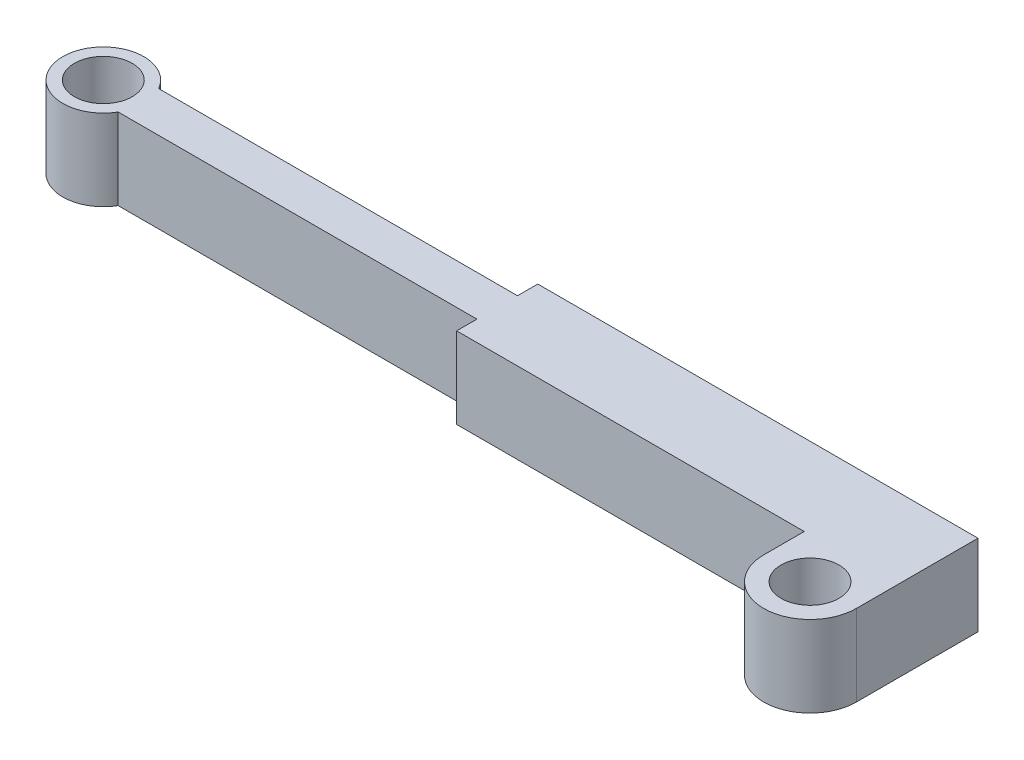
ISO-10303-21;
HEADER;
FILE_DESCRIPTION(('STEP AP214'),'2;1');
FILE_NAME('part.step','',(''),(''),'','','');
FILE_SCHEMA(('AUTOMOTIVE_DESIGN { 1 0 10303 214 1 1 1 1 }'));
ENDSEC;
DATA;
#1=APPLICATION_CONTEXT('core data for automotive mechanical design processes');
#2=APPLICATION_PROTOCOL_DEFINITION('international standard','automotive_design',2000,#1);
#3=PRODUCT_CONTEXT('',#1,'mechanical');
#4=PRODUCT('Part','Part','',(#3));
#5=PRODUCT_RELATED_PRODUCT_CATEGORY('part','',(#4));
#6=PRODUCT_DEFINITION_FORMATION('','',#4);
#7=PRODUCT_DEFINITION_CONTEXT('part definition',#1,'design');
#8=PRODUCT_DEFINITION('design','',#6,#7);
#9=PRODUCT_DEFINITION_SHAPE('','',#8);
#10=(LENGTH_UNIT() NAMED_UNIT(*) SI_UNIT(.MILLI.,.METRE.));
#11=(NAMED_UNIT(*) PLANE_ANGLE_UNIT() SI_UNIT($,.RADIAN.));
#12=(NAMED_UNIT(*) SI_UNIT($,.STERADIAN.) SOLID_ANGLE_UNIT());
#13=UNCERTAINTY_MEASURE_WITH_UNIT(LENGTH_MEASURE(1.E-05),#10,'distance_accuracy_value','');
#14=(GEOMETRIC_REPRESENTATION_CONTEXT(3) GLOBAL_UNCERTAINTY_ASSIGNED_CONTEXT((#13)) GLOBAL_UNIT_ASSIGNED_CONTEXT((#10,
#11,#12)) REPRESENTATION_CONTEXT('',''));
#15=CARTESIAN_POINT('',(0.,0.,0.));
#16=DIRECTION('',(0.,0.,1.));
#17=DIRECTION('',(1.,0.,0.));
#18=AXIS2_PLACEMENT_3D('',#15,#16,#17);
#19=CARTESIAN_POINT('',(0.,7.,-3.5));
#20=DIRECTION('',(0.,0.,-1.));
#21=DIRECTION('',(-1.,0.,0.));
#22=AXIS2_PLACEMENT_3D('',#19,#20,#21);
#23=PLANE('',#22);
#24=DIRECTION('',(1.,0.,0.));
#25=VECTOR('',#24,1.);
#26=CARTESIAN_POINT('',(0.,0.,-3.5));
#27=LINE('',#26,#25);
#28=CARTESIAN_POINT('',(38.,0.,-3.5));
#29=VERTEX_POINT('',#28);
#30=CARTESIAN_POINT('',(76.,0.,-3.5));
#31=VERTEX_POINT('',#30);
#32=EDGE_CURVE('E144',#29,#31,#27,.T.);
#33=ORIENTED_EDGE('',*,*,#32,.F.);
#34=DIRECTION('',(0.,-1.,0.));
#35=VECTOR('',#34,1.);
#36=CARTESIAN_POINT('',(38.,7.,-3.5));
#37=LINE('',#36,#35);
#38=CARTESIAN_POINT('',(38.,7.,-3.5));
#39=VERTEX_POINT('',#38);
#40=EDGE_CURVE('E11',#39,#29,#37,.T.);
#41=ORIENTED_EDGE('',*,*,#40,.F.);
#42=DIRECTION('',(1.,0.,0.));
#43=VECTOR('',#42,1.);
#44=CARTESIAN_POINT('',(0.,7.,-3.5));
#45=LINE('',#44,#43);
#46=CARTESIAN_POINT('',(76.,7.,-3.5));
#47=VERTEX_POINT('',#46);
#48=EDGE_CURVE('E173',#39,#47,#45,.T.);
#49=ORIENTED_EDGE('',*,*,#48,.T.);
#50=DIRECTION('',(0.,-1.,0.));
#51=VECTOR('',#50,1.);
#52=CARTESIAN_POINT('',(76.,7.,-3.5));
#53=LINE('',#52,#51);
#54=EDGE_CURVE('E90',#47,#31,#53,.T.);
#55=ORIENTED_EDGE('',*,*,#54,.T.);
#56=EDGE_LOOP('',(#33,#41,#49,#55));
#57=FACE_BOUND('',#56,.T.);
#58=ADVANCED_FACE('F33',(#57),#23,.T.);
#59=CARTESIAN_POINT('',(38.,7.,0.));
#60=DIRECTION('',(-1.,0.,0.));
#61=DIRECTION('',(0.,0.,1.));
#62=AXIS2_PLACEMENT_3D('',#59,#60,#61);
#63=PLANE('',#62);
#64=DIRECTION('',(0.,0.,-1.));
#65=VECTOR('',#64,1.);
#66=CARTESIAN_POINT('',(38.,0.,0.));
#67=LINE('',#66,#65);
#68=CARTESIAN_POINT('',(38.,0.,-1.75));
#69=VERTEX_POINT('',#68);
#70=EDGE_CURVE('E147',#69,#29,#67,.T.);
#71=ORIENTED_EDGE('',*,*,#70,.F.);
#72=DIRECTION('',(0.,-1.,0.));
#73=VECTOR('',#72,1.);
#74=CARTESIAN_POINT('',(38.,7.,-1.75));
#75=LINE('',#74,#73);
#76=CARTESIAN_POINT('',(38.,7.,-1.75));
#77=VERTEX_POINT('',#76);
#78=EDGE_CURVE('E41',#77,#69,#75,.T.);
#79=ORIENTED_EDGE('',*,*,#78,.F.);
#80=DIRECTION('',(0.,0.,-1.));
#81=VECTOR('',#80,1.);
#82=CARTESIAN_POINT('',(38.,7.,0.));
#83=LINE('',#82,#81);
#84=EDGE_CURVE('E200',#77,#39,#83,.T.);
#85=ORIENTED_EDGE('',*,*,#84,.T.);
#86=ORIENTED_EDGE('',*,*,#40,.T.);
#87=EDGE_LOOP('',(#71,#79,#85,#86));
#88=FACE_BOUND('',#87,.T.);
#89=ADVANCED_FACE('F199',(#88),#63,.T.);
#90=CARTESIAN_POINT('',(0.,7.,-1.75));
#91=DIRECTION('',(0.,0.,1.));
#92=DIRECTION('',(1.,0.,0.));
#93=AXIS2_PLACEMENT_3D('',#90,#91,#92);
#94=PLANE('',#93);
#95=DIRECTION('',(-1.,0.,0.));
#96=VECTOR('',#95,1.);
#97=CARTESIAN_POINT('',(0.,0.,-1.75));
#98=LINE('',#97,#96);
#99=CARTESIAN_POINT('',(7.03108891324553,0.,-1.75));
#100=VERTEX_POINT('',#99);
#101=EDGE_CURVE('E150',#69,#100,#98,.T.);
#102=ORIENTED_EDGE('',*,*,#101,.T.);
#103=DIRECTION('',(0.,-1.,0.));
#104=VECTOR('',#103,1.);
#105=CARTESIAN_POINT('',(7.03108891324553,7.,-1.75));
#106=LINE('',#105,#104);
#107=CARTESIAN_POINT('',(7.03108891324553,7.,-1.75));
#108=VERTEX_POINT('',#107);
#109=EDGE_CURVE('E184',#108,#100,#106,.T.);
#110=ORIENTED_EDGE('',*,*,#109,.F.);
#111=DIRECTION('',(-1.,0.,0.));
#112=VECTOR('',#111,1.);
#113=CARTESIAN_POINT('',(0.,7.,-1.75));
#114=LINE('',#113,#112);
#115=EDGE_CURVE('E190',#77,#108,#114,.T.);
#116=ORIENTED_EDGE('',*,*,#115,.F.);
#117=ORIENTED_EDGE('',*,*,#78,.T.);
#118=EDGE_LOOP('',(#102,#110,#116,#117));
#119=FACE_BOUND('',#118,.T.);
#120=ADVANCED_FACE('F188',(#119),#94,.F.);
#121=CARTESIAN_POINT('',(4.,7.,0.));
#122=DIRECTION('',(0.,-1.,0.));
#123=DIRECTION('',(0.,0.,-1.));
#124=AXIS2_PLACEMENT_3D('',#121,#122,#123);
#125=CYLINDRICAL_SURFACE('',#124,3.5);
#126=CARTESIAN_POINT('',(4.,0.,0.));
#127=DIRECTION('',(0.,1.,0.));
#128=DIRECTION('',(0.,0.,1.));
#129=AXIS2_PLACEMENT_3D('',#126,#127,#128);
#130=CIRCLE('',#129,3.5);
#131=CARTESIAN_POINT('',(7.03108891324553,0.,1.75));
#132=VERTEX_POINT('',#131);
#133=EDGE_CURVE('E153',#132,#100,#130,.F.);
#134=ORIENTED_EDGE('',*,*,#133,.F.);
#135=DIRECTION('',(0.,-1.,0.));
#136=VECTOR('',#135,1.);
#137=CARTESIAN_POINT('',(7.03108891324553,7.,1.75));
#138=LINE('',#137,#136);
#139=CARTESIAN_POINT('',(7.03108891324553,7.,1.75));
#140=VERTEX_POINT('',#139);
#141=EDGE_CURVE('E182',#140,#132,#138,.T.);
#142=ORIENTED_EDGE('',*,*,#141,.F.);
#143=CARTESIAN_POINT('',(4.,7.,0.));
#144=DIRECTION('',(0.,1.,0.));
#145=DIRECTION('',(0.,0.,1.));
#146=AXIS2_PLACEMENT_3D('',#143,#144,#145);
#147=CIRCLE('',#146,3.5);
#148=EDGE_CURVE('E208',#140,#108,#147,.F.);
#149=ORIENTED_EDGE('',*,*,#148,.T.);
#150=ORIENTED_EDGE('',*,*,#109,.T.);
#151=EDGE_LOOP('',(#134,#142,#149,#150));
#152=FACE_BOUND('',#151,.T.);
#153=ADVANCED_FACE('F229',(#152),#125,.T.);
#154=CARTESIAN_POINT('',(0.,7.,1.75));
#155=DIRECTION('',(0.,0.,1.));
#156=DIRECTION('',(1.,0.,0.));
#157=AXIS2_PLACEMENT_3D('',#154,#155,#156);
#158=PLANE('',#157);
#159=DIRECTION('',(-1.,0.,0.));
#160=VECTOR('',#159,1.);
#161=CARTESIAN_POINT('',(0.,0.,1.75));
#162=LINE('',#161,#160);
#163=CARTESIAN_POINT('',(38.,0.,1.75));
#164=VERTEX_POINT('',#163);
#165=EDGE_CURVE('E156',#164,#132,#162,.T.);
#166=ORIENTED_EDGE('',*,*,#165,.F.);
#167=DIRECTION('',(0.,-1.,0.));
#168=VECTOR('',#167,1.);
#169=CARTESIAN_POINT('',(38.,7.,1.75));
#170=LINE('',#169,#168);
#171=CARTESIAN_POINT('',(38.,7.,1.75));
#172=VERTEX_POINT('',#171);
#173=EDGE_CURVE('E180',#172,#164,#170,.T.);
#174=ORIENTED_EDGE('',*,*,#173,.F.);
#175=DIRECTION('',(-1.,0.,0.));
#176=VECTOR('',#175,1.);
#177=CARTESIAN_POINT('',(0.,7.,1.75));
#178=LINE('',#177,#176);
#179=EDGE_CURVE('E211',#172,#140,#178,.T.);
#180=ORIENTED_EDGE('',*,*,#179,.T.);
#181=ORIENTED_EDGE('',*,*,#141,.T.);
#182=EDGE_LOOP('',(#166,#174,#180,#181));
#183=FACE_BOUND('',#182,.T.);
#184=ADVANCED_FACE('F227',(#183),#158,.T.);
#185=CARTESIAN_POINT('',(38.,7.,0.));
#186=DIRECTION('',(1.,0.,0.));
#187=DIRECTION('',(0.,0.,-1.));
#188=AXIS2_PLACEMENT_3D('',#185,#186,#187);
#189=PLANE('',#188);
#190=DIRECTION('',(0.,0.,1.));
#191=VECTOR('',#190,1.);
#192=CARTESIAN_POINT('',(38.,0.,0.));
#193=LINE('',#192,#191);
#194=CARTESIAN_POINT('',(38.,0.,3.5));
#195=VERTEX_POINT('',#194);
#196=EDGE_CURVE('E159',#164,#195,#193,.T.);
#197=ORIENTED_EDGE('',*,*,#196,.T.);
#198=DIRECTION('',(0.,-1.,0.));
#199=VECTOR('',#198,1.);
#200=CARTESIAN_POINT('',(38.,7.,3.5));
#201=LINE('',#200,#199);
#202=CARTESIAN_POINT('',(38.,7.,3.5));
#203=VERTEX_POINT('',#202);
#204=EDGE_CURVE('E177',#203,#195,#201,.T.);
#205=ORIENTED_EDGE('',*,*,#204,.F.);
#206=DIRECTION('',(0.,0.,1.));
#207=VECTOR('',#206,1.);
#208=CARTESIAN_POINT('',(38.,7.,0.));
#209=LINE('',#208,#207);
#210=EDGE_CURVE('E214',#172,#203,#209,.T.);
#211=ORIENTED_EDGE('',*,*,#210,.F.);
#212=ORIENTED_EDGE('',*,*,#173,.T.);
#213=EDGE_LOOP('',(#197,#205,#211,#212));
#214=FACE_BOUND('',#213,.T.);
#215=ADVANCED_FACE('F220',(#214),#189,.F.);
#216=CARTESIAN_POINT('',(0.,7.,3.5));
#217=DIRECTION('',(0.,0.,-1.));
#218=DIRECTION('',(-1.,0.,0.));
#219=AXIS2_PLACEMENT_3D('',#216,#217,#218);
#220=PLANE('',#219);
#221=DIRECTION('',(1.,0.,0.));
#222=VECTOR('',#221,1.);
#223=CARTESIAN_POINT('',(0.,0.,3.5));
#224=LINE('',#223,#222);
#225=CARTESIAN_POINT('',(68.,0.,3.5));
#226=VERTEX_POINT('',#225);
#227=EDGE_CURVE('E161',#195,#226,#224,.T.);
#228=ORIENTED_EDGE('',*,*,#227,.T.);
#229=DIRECTION('',(0.,-1.,0.));
#230=VECTOR('',#229,1.);
#231=CARTESIAN_POINT('',(68.,7.,3.5));
#232=LINE('',#231,#230);
#233=CARTESIAN_POINT('',(68.,7.,3.5));
#234=VERTEX_POINT('',#233);
#235=EDGE_CURVE('E130',#234,#226,#232,.T.);
#236=ORIENTED_EDGE('',*,*,#235,.F.);
#237=DIRECTION('',(1.,0.,0.));
#238=VECTOR('',#237,1.);
#239=CARTESIAN_POINT('',(0.,7.,3.5));
#240=LINE('',#239,#238);
#241=EDGE_CURVE('E121',#203,#234,#240,.T.);
#242=ORIENTED_EDGE('',*,*,#241,.F.);
#243=ORIENTED_EDGE('',*,*,#204,.T.);
#244=EDGE_LOOP('',(#228,#236,#242,#243));
#245=FACE_BOUND('',#244,.T.);
#246=ADVANCED_FACE('F224',(#245),#220,.F.);
#247=CARTESIAN_POINT('',(68.,7.,0.));
#248=DIRECTION('',(1.,0.,0.));
#249=DIRECTION('',(0.,0.,-1.));
#250=AXIS2_PLACEMENT_3D('',#247,#248,#249);
#251=PLANE('',#250);
#252=DIRECTION('',(0.,0.,1.));
#253=VECTOR('',#252,1.);
#254=CARTESIAN_POINT('',(68.,0.,0.));
#255=LINE('',#254,#253);
#256=CARTESIAN_POINT('',(68.,0.,7.));
#257=VERTEX_POINT('',#256);
#258=EDGE_CURVE('E129',#226,#257,#255,.T.);
#259=ORIENTED_EDGE('',*,*,#258,.T.);
#260=DIRECTION('',(0.,-1.,0.));
#261=VECTOR('',#260,1.);
#262=CARTESIAN_POINT('',(68.,7.,7.));
#263=LINE('',#262,#261);
#264=CARTESIAN_POINT('',(68.,7.,7.));
#265=VERTEX_POINT('',#264);
#266=EDGE_CURVE('E126',#265,#257,#263,.T.);
#267=ORIENTED_EDGE('',*,*,#266,.F.);
#268=DIRECTION('',(0.,0.,1.));
#269=VECTOR('',#268,1.);
#270=CARTESIAN_POINT('',(68.,7.,0.));
#271=LINE('',#270,#269);
#272=EDGE_CURVE('E114',#234,#265,#271,.T.);
#273=ORIENTED_EDGE('',*,*,#272,.F.);
#274=ORIENTED_EDGE('',*,*,#235,.T.);
#275=EDGE_LOOP('',(#259,#267,#273,#274));
#276=FACE_BOUND('',#275,.T.);
#277=ADVANCED_FACE('F127',(#276),#251,.F.);
#278=CARTESIAN_POINT('',(72.,7.,7.00000000000001));
#279=DIRECTION('',(0.,-1.,0.));
#280=DIRECTION('',(0.,0.,-1.));
#281=AXIS2_PLACEMENT_3D('',#278,#279,#280);
#282=CYLINDRICAL_SURFACE('',#281,4.);
#283=CARTESIAN_POINT('',(72.,0.,7.00000000000001));
#284=DIRECTION('',(0.,1.,0.));
#285=DIRECTION('',(0.,0.,1.));
#286=AXIS2_PLACEMENT_3D('',#283,#284,#285);
#287=CIRCLE('',#286,4.);
#288=CARTESIAN_POINT('',(76.,0.,7.));
#289=VERTEX_POINT('',#288);
#290=EDGE_CURVE('E83',#257,#289,#287,.T.);
#291=ORIENTED_EDGE('',*,*,#290,.T.);
#292=DIRECTION('',(0.,-1.,0.));
#293=VECTOR('',#292,1.);
#294=CARTESIAN_POINT('',(76.,7.,7.));
#295=LINE('',#294,#293);
#296=CARTESIAN_POINT('',(76.,7.,7.));
#297=VERTEX_POINT('',#296);
#298=EDGE_CURVE('E131',#297,#289,#295,.T.);
#299=ORIENTED_EDGE('',*,*,#298,.F.);
#300=CARTESIAN_POINT('',(72.,7.,7.00000000000001));
#301=DIRECTION('',(0.,1.,0.));
#302=DIRECTION('',(0.,0.,1.));
#303=AXIS2_PLACEMENT_3D('',#300,#301,#302);
#304=CIRCLE('',#303,4.);
#305=EDGE_CURVE('E119',#265,#297,#304,.T.);
#306=ORIENTED_EDGE('',*,*,#305,.F.);
#307=ORIENTED_EDGE('',*,*,#266,.T.);
#308=EDGE_LOOP('',(#291,#299,#306,#307));
#309=FACE_BOUND('',#308,.T.);
#310=ADVANCED_FACE('F133',(#309),#282,.T.);
#311=CARTESIAN_POINT('',(72.,7.,7.));
#312=DIRECTION('',(0.,-1.,0.));
#313=DIRECTION('',(0.,0.,-1.));
#314=AXIS2_PLACEMENT_3D('',#311,#312,#313);
#315=CYLINDRICAL_SURFACE('',#314,2.5);
#316=CARTESIAN_POINT('',(72.,7.,7.));
#317=DIRECTION('',(0.,1.,0.));
#318=DIRECTION('',(0.,0.,1.));
#319=AXIS2_PLACEMENT_3D('',#316,#317,#318);
#320=CIRCLE('',#319,2.5);
#321=CARTESIAN_POINT('',(72.,7.,9.49999999999999));
#322=VERTEX_POINT('',#321);
#323=EDGE_CURVE('E135',#322,#322,#320,.T.);
#324=ORIENTED_EDGE('',*,*,#323,.T.);
#325=EDGE_LOOP('',(#324));
#326=FACE_BOUND('',#325,.T.);
#327=CARTESIAN_POINT('',(72.,0.,7.));
#328=DIRECTION('',(0.,1.,0.));
#329=DIRECTION('',(0.,0.,1.));
#330=AXIS2_PLACEMENT_3D('',#327,#328,#329);
#331=CIRCLE('',#330,2.5);
#332=CARTESIAN_POINT('',(72.,0.,9.49999999999999));
#333=VERTEX_POINT('',#332);
#334=EDGE_CURVE('E167',#333,#333,#331,.T.);
#335=ORIENTED_EDGE('',*,*,#334,.F.);
#336=EDGE_LOOP('',(#335));
#337=FACE_BOUND('',#336,.T.);
#338=ADVANCED_FACE('F294',(#326,#337),#315,.F.);
#339=CARTESIAN_POINT('',(76.,7.,0.));
#340=DIRECTION('',(-1.,0.,0.));
#341=DIRECTION('',(0.,0.,1.));
#342=AXIS2_PLACEMENT_3D('',#339,#340,#341);
#343=PLANE('',#342);
#344=DIRECTION('',(0.,0.,-1.));
#345=VECTOR('',#344,1.);
#346=CARTESIAN_POINT('',(76.,0.,0.));
#347=LINE('',#346,#345);
#348=EDGE_CURVE('E165',#289,#31,#347,.T.);
#349=ORIENTED_EDGE('',*,*,#348,.T.);
#350=ORIENTED_EDGE('',*,*,#54,.F.);
#351=DIRECTION('',(0.,0.,-1.));
#352=VECTOR('',#351,1.);
#353=CARTESIAN_POINT('',(76.,7.,0.));
#354=LINE('',#353,#352);
#355=EDGE_CURVE('E49',#297,#47,#354,.T.);
#356=ORIENTED_EDGE('',*,*,#355,.F.);
#357=ORIENTED_EDGE('',*,*,#298,.T.);
#358=EDGE_LOOP('',(#349,#350,#356,#357));
#359=FACE_BOUND('',#358,.T.);
#360=ADVANCED_FACE('F203',(#359),#343,.F.);
#361=CARTESIAN_POINT('',(4.,7.,0.));
#362=DIRECTION('',(0.,-1.,0.));
#363=DIRECTION('',(0.,0.,-1.));
#364=AXIS2_PLACEMENT_3D('',#361,#362,#363);
#365=CYLINDRICAL_SURFACE('',#364,2.5);
#366=CARTESIAN_POINT('',(4.,7.,0.));
#367=DIRECTION('',(0.,1.,0.));
#368=DIRECTION('',(0.,0.,1.));
#369=AXIS2_PLACEMENT_3D('',#366,#367,#368);
#370=CIRCLE('',#369,2.5);
#371=CARTESIAN_POINT('',(4.,7.,2.5));
#372=VERTEX_POINT('',#371);
#373=EDGE_CURVE('E141',#372,#372,#370,.T.);
#374=ORIENTED_EDGE('',*,*,#373,.T.);
#375=EDGE_LOOP('',(#374));
#376=FACE_BOUND('',#375,.T.);
#377=CARTESIAN_POINT('',(4.,0.,0.));
#378=DIRECTION('',(0.,1.,0.));
#379=DIRECTION('',(0.,0.,1.));
#380=AXIS2_PLACEMENT_3D('',#377,#378,#379);
#381=CIRCLE('',#380,2.5);
#382=CARTESIAN_POINT('',(4.,0.,2.5));
#383=VERTEX_POINT('',#382);
#384=EDGE_CURVE('E170',#383,#383,#381,.T.);
#385=ORIENTED_EDGE('',*,*,#384,.F.);
#386=EDGE_LOOP('',(#385));
#387=FACE_BOUND('',#386,.T.);
#388=ADVANCED_FACE('F313',(#376,#387),#365,.F.);
#389=CARTESIAN_POINT('',(0.,7.,0.));
#390=DIRECTION('',(0.,1.,0.));
#391=DIRECTION('',(0.,0.,1.));
#392=AXIS2_PLACEMENT_3D('',#389,#390,#391);
#393=PLANE('',#392);
#394=ORIENTED_EDGE('',*,*,#48,.F.);
#395=ORIENTED_EDGE('',*,*,#84,.F.);
#396=ORIENTED_EDGE('',*,*,#115,.T.);
#397=ORIENTED_EDGE('',*,*,#148,.F.);
#398=ORIENTED_EDGE('',*,*,#179,.F.);
#399=ORIENTED_EDGE('',*,*,#210,.T.);
#400=ORIENTED_EDGE('',*,*,#241,.T.);
#401=ORIENTED_EDGE('',*,*,#272,.T.);
#402=ORIENTED_EDGE('',*,*,#305,.T.);
#403=ORIENTED_EDGE('',*,*,#355,.T.);
#404=EDGE_LOOP('',(#394,#395,#396,#397,#398,#399,#400,#401,#402,#403));
#405=FACE_BOUND('',#404,.T.);
#406=ORIENTED_EDGE('',*,*,#323,.F.);
#407=EDGE_LOOP('',(#406));
#408=FACE_BOUND('',#407,.T.);
#409=ORIENTED_EDGE('',*,*,#373,.F.);
#410=EDGE_LOOP('',(#409));
#411=FACE_BOUND('',#410,.T.);
#412=ADVANCED_FACE('F116',(#405,#408,#411),#393,.T.);
#413=CARTESIAN_POINT('',(0.,0.,0.));
#414=DIRECTION('',(0.,1.,0.));
#415=DIRECTION('',(0.,0.,1.));
#416=AXIS2_PLACEMENT_3D('',#413,#414,#415);
#417=PLANE('',#416);
#418=ORIENTED_EDGE('',*,*,#32,.T.);
#419=ORIENTED_EDGE('',*,*,#348,.F.);
#420=ORIENTED_EDGE('',*,*,#290,.F.);
#421=ORIENTED_EDGE('',*,*,#258,.F.);
#422=ORIENTED_EDGE('',*,*,#227,.F.);
#423=ORIENTED_EDGE('',*,*,#196,.F.);
#424=ORIENTED_EDGE('',*,*,#165,.T.);
#425=ORIENTED_EDGE('',*,*,#133,.T.);
#426=ORIENTED_EDGE('',*,*,#101,.F.);
#427=ORIENTED_EDGE('',*,*,#70,.T.);
#428=EDGE_LOOP('',(#418,#419,#420,#421,#422,#423,#424,#425,#426,#427));
#429=FACE_BOUND('',#428,.T.);
#430=ORIENTED_EDGE('',*,*,#334,.T.);
#431=EDGE_LOOP('',(#430));
#432=FACE_BOUND('',#431,.T.);
#433=ORIENTED_EDGE('',*,*,#384,.T.);
#434=EDGE_LOOP('',(#433));
#435=FACE_BOUND('',#434,.T.);
#436=ADVANCED_FACE('F196',(#429,#432,#435),#417,.F.);
#437=CLOSED_SHELL('',(#58,#89,#120,#153,#184,#215,#246,#277,#310,#338,#360,#388,#412,#436));
#438=MANIFOLD_SOLID_BREP('B2',#437);
#439=ADVANCED_BREP_SHAPE_REPRESENTATION('',(#18,#438),#14);
#440=SHAPE_DEFINITION_REPRESENTATION(#9,#439);
ENDSEC;
END-ISO-10303-21;
